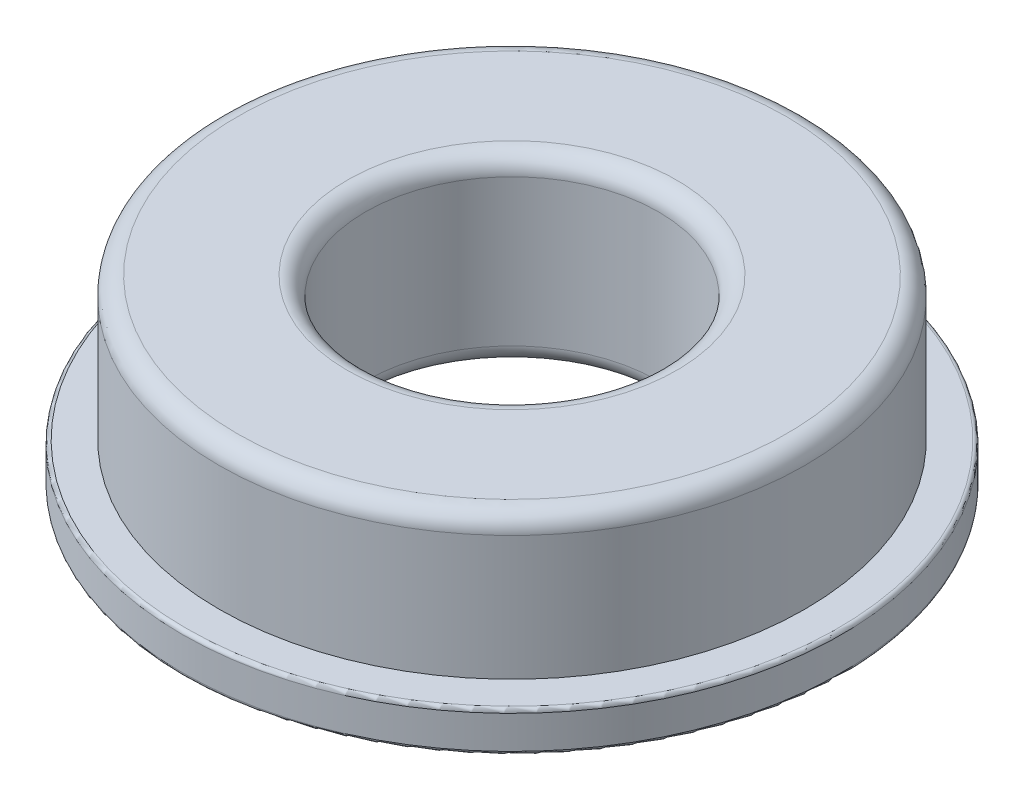
ISO-10303-21;
HEADER;
FILE_DESCRIPTION(('STEP AP214'),'2;1');
FILE_NAME('part.step','',(''),(''),'','','');
FILE_SCHEMA(('AUTOMOTIVE_DESIGN { 1 0 10303 214 1 1 1 1 }'));
ENDSEC;
DATA;
#1=APPLICATION_CONTEXT('core data for automotive mechanical design processes');
#2=APPLICATION_PROTOCOL_DEFINITION('international standard','automotive_design',2000,#1);
#3=PRODUCT_CONTEXT('',#1,'mechanical');
#4=PRODUCT('Part','Part','',(#3));
#5=PRODUCT_RELATED_PRODUCT_CATEGORY('part','',(#4));
#6=PRODUCT_DEFINITION_FORMATION('','',#4);
#7=PRODUCT_DEFINITION_CONTEXT('part definition',#1,'design');
#8=PRODUCT_DEFINITION('design','',#6,#7);
#9=PRODUCT_DEFINITION_SHAPE('','',#8);
#10=(LENGTH_UNIT() NAMED_UNIT(*) SI_UNIT(.MILLI.,.METRE.));
#11=(NAMED_UNIT(*) PLANE_ANGLE_UNIT() SI_UNIT($,.RADIAN.));
#12=(NAMED_UNIT(*) SI_UNIT($,.STERADIAN.) SOLID_ANGLE_UNIT());
#13=UNCERTAINTY_MEASURE_WITH_UNIT(LENGTH_MEASURE(1.E-05),#10,'distance_accuracy_value','');
#14=(GEOMETRIC_REPRESENTATION_CONTEXT(3) GLOBAL_UNCERTAINTY_ASSIGNED_CONTEXT((#13)) GLOBAL_UNIT_ASSIGNED_CONTEXT((#10,
#11,#12)) REPRESENTATION_CONTEXT('',''));
#15=CARTESIAN_POINT('',(0.,0.,0.));
#16=DIRECTION('',(0.,0.,1.));
#17=DIRECTION('',(1.,0.,0.));
#18=AXIS2_PLACEMENT_3D('',#15,#16,#17);
#19=CARTESIAN_POINT('',(0.,5.,0.));
#20=DIRECTION('',(0.,-1.,0.));
#21=DIRECTION('',(0.,0.,-1.));
#22=AXIS2_PLACEMENT_3D('',#19,#20,#21);
#23=CYLINDRICAL_SURFACE('',#22,9.);
#24=CARTESIAN_POINT('',(0.,0.1,0.));
#25=DIRECTION('',(0.,1.,0.));
#26=DIRECTION('',(0.,0.,1.));
#27=AXIS2_PLACEMENT_3D('',#24,#25,#26);
#28=CIRCLE('',#27,9.);
#29=CARTESIAN_POINT('',(0.,0.1,9.));
#30=VERTEX_POINT('',#29);
#31=EDGE_CURVE('E37',#30,#30,#28,.T.);
#32=ORIENTED_EDGE('',*,*,#31,.T.);
#33=EDGE_LOOP('',(#32));
#34=FACE_BOUND('',#33,.T.);
#35=CARTESIAN_POINT('',(0.,1.,0.));
#36=DIRECTION('',(0.,1.,0.));
#37=DIRECTION('',(0.,0.,1.));
#38=AXIS2_PLACEMENT_3D('',#35,#36,#37);
#39=CIRCLE('',#38,9.);
#40=CARTESIAN_POINT('',(0.,1.,9.));
#41=VERTEX_POINT('',#40);
#42=EDGE_CURVE('E41',#41,#41,#39,.F.);
#43=ORIENTED_EDGE('',*,*,#42,.T.);
#44=EDGE_LOOP('',(#43));
#45=FACE_BOUND('',#44,.T.);
#46=ADVANCED_FACE('F30',(#34,#45),#23,.T.);
#47=CARTESIAN_POINT('',(0.,0.,0.));
#48=DIRECTION('',(0.,1.,0.));
#49=DIRECTION('',(0.,0.,1.));
#50=AXIS2_PLACEMENT_3D('',#47,#48,#49);
#51=PLANE('',#50);
#52=CARTESIAN_POINT('',(0.,0.,0.));
#53=DIRECTION('',(0.,1.,0.));
#54=DIRECTION('',(0.,0.,1.));
#55=AXIS2_PLACEMENT_3D('',#52,#53,#54);
#56=CIRCLE('',#55,8.9);
#57=CARTESIAN_POINT('',(0.,0.,8.9));
#58=VERTEX_POINT('',#57);
#59=EDGE_CURVE('E10',#58,#58,#56,.F.);
#60=ORIENTED_EDGE('',*,*,#59,.T.);
#61=EDGE_LOOP('',(#60));
#62=FACE_BOUND('',#61,.T.);
#63=CARTESIAN_POINT('',(0.,0.,0.));
#64=DIRECTION('',(0.,1.,0.));
#65=DIRECTION('',(0.,0.,1.));
#66=AXIS2_PLACEMENT_3D('',#63,#64,#65);
#67=CIRCLE('',#66,4.5);
#68=CARTESIAN_POINT('',(0.,0.,4.5));
#69=VERTEX_POINT('',#68);
#70=EDGE_CURVE('E65',#69,#69,#67,.T.);
#71=ORIENTED_EDGE('',*,*,#70,.T.);
#72=EDGE_LOOP('',(#71));
#73=FACE_BOUND('',#72,.T.);
#74=ADVANCED_FACE('F76',(#62,#73),#51,.F.);
#75=CARTESIAN_POINT('',(0.,1.1,0.));
#76=DIRECTION('',(0.,1.,0.));
#77=DIRECTION('',(0.,0.,1.));
#78=AXIS2_PLACEMENT_3D('',#75,#76,#77);
#79=PLANE('',#78);
#80=CARTESIAN_POINT('',(0.,1.1,0.));
#81=DIRECTION('',(0.,1.,0.));
#82=DIRECTION('',(0.,0.,1.));
#83=AXIS2_PLACEMENT_3D('',#80,#81,#82);
#84=CIRCLE('',#83,8.9);
#85=CARTESIAN_POINT('',(0.,1.1,8.9));
#86=VERTEX_POINT('',#85);
#87=EDGE_CURVE('E45',#86,#86,#84,.T.);
#88=ORIENTED_EDGE('',*,*,#87,.T.);
#89=EDGE_LOOP('',(#88));
#90=FACE_BOUND('',#89,.T.);
#91=CARTESIAN_POINT('',(0.,1.1,0.));
#92=DIRECTION('',(0.,1.,0.));
#93=DIRECTION('',(0.,0.,1.));
#94=AXIS2_PLACEMENT_3D('',#91,#92,#93);
#95=CIRCLE('',#94,8.);
#96=CARTESIAN_POINT('',(0.,1.1,8.));
#97=VERTEX_POINT('',#96);
#98=EDGE_CURVE('E68',#97,#97,#95,.T.);
#99=ORIENTED_EDGE('',*,*,#98,.F.);
#100=EDGE_LOOP('',(#99));
#101=FACE_BOUND('',#100,.T.);
#102=ADVANCED_FACE('F74',(#90,#101),#79,.T.);
#103=CARTESIAN_POINT('',(0.,1.1,0.));
#104=DIRECTION('',(0.,1.,0.));
#105=DIRECTION('',(0.,0.,1.));
#106=AXIS2_PLACEMENT_3D('',#103,#104,#105);
#107=CYLINDRICAL_SURFACE('',#106,8.);
#108=CARTESIAN_POINT('',(0.,4.5,0.));
#109=DIRECTION('',(0.,1.,0.));
#110=DIRECTION('',(0.,0.,1.));
#111=AXIS2_PLACEMENT_3D('',#108,#109,#110);
#112=CIRCLE('',#111,8.);
#113=CARTESIAN_POINT('',(0.,4.5,8.));
#114=VERTEX_POINT('',#113);
#115=EDGE_CURVE('E50',#114,#114,#112,.F.);
#116=ORIENTED_EDGE('',*,*,#115,.T.);
#117=EDGE_LOOP('',(#116));
#118=FACE_BOUND('',#117,.T.);
#119=ORIENTED_EDGE('',*,*,#98,.T.);
#120=EDGE_LOOP('',(#119));
#121=FACE_BOUND('',#120,.T.);
#122=ADVANCED_FACE('F72',(#118,#121),#107,.T.);
#123=CARTESIAN_POINT('',(0.,5.,0.));
#124=DIRECTION('',(0.,1.,0.));
#125=DIRECTION('',(0.,0.,1.));
#126=AXIS2_PLACEMENT_3D('',#123,#124,#125);
#127=PLANE('',#126);
#128=CARTESIAN_POINT('',(0.,5.,0.));
#129=DIRECTION('',(0.,1.,0.));
#130=DIRECTION('',(0.,0.,1.));
#131=AXIS2_PLACEMENT_3D('',#128,#129,#130);
#132=CIRCLE('',#131,4.5);
#133=CARTESIAN_POINT('',(0.,5.,4.5));
#134=VERTEX_POINT('',#133);
#135=EDGE_CURVE('E53',#134,#134,#132,.F.);
#136=ORIENTED_EDGE('',*,*,#135,.T.);
#137=EDGE_LOOP('',(#136));
#138=FACE_BOUND('',#137,.T.);
#139=CARTESIAN_POINT('',(0.,5.,0.));
#140=DIRECTION('',(0.,1.,0.));
#141=DIRECTION('',(0.,0.,1.));
#142=AXIS2_PLACEMENT_3D('',#139,#140,#141);
#143=CIRCLE('',#142,7.5);
#144=CARTESIAN_POINT('',(0.,5.,7.5));
#145=VERTEX_POINT('',#144);
#146=EDGE_CURVE('E56',#145,#145,#143,.T.);
#147=ORIENTED_EDGE('',*,*,#146,.T.);
#148=EDGE_LOOP('',(#147));
#149=FACE_BOUND('',#148,.T.);
#150=ADVANCED_FACE('F83',(#138,#149),#127,.T.);
#151=CARTESIAN_POINT('',(0.,0.,0.));
#152=DIRECTION('',(0.,1.,0.));
#153=DIRECTION('',(0.,0.,1.));
#154=AXIS2_PLACEMENT_3D('',#151,#152,#153);
#155=CYLINDRICAL_SURFACE('',#154,4.);
#156=CARTESIAN_POINT('',(0.,0.5,0.));
#157=DIRECTION('',(0.,1.,0.));
#158=DIRECTION('',(0.,0.,1.));
#159=AXIS2_PLACEMENT_3D('',#156,#157,#158);
#160=CIRCLE('',#159,4.);
#161=CARTESIAN_POINT('',(0.,0.5,4.));
#162=VERTEX_POINT('',#161);
#163=EDGE_CURVE('E59',#162,#162,#160,.F.);
#164=ORIENTED_EDGE('',*,*,#163,.T.);
#165=EDGE_LOOP('',(#164));
#166=FACE_BOUND('',#165,.T.);
#167=CARTESIAN_POINT('',(0.,4.5,0.));
#168=DIRECTION('',(0.,1.,0.));
#169=DIRECTION('',(0.,0.,1.));
#170=AXIS2_PLACEMENT_3D('',#167,#168,#169);
#171=CIRCLE('',#170,4.);
#172=CARTESIAN_POINT('',(0.,4.5,4.));
#173=VERTEX_POINT('',#172);
#174=EDGE_CURVE('E62',#173,#173,#171,.T.);
#175=ORIENTED_EDGE('',*,*,#174,.T.);
#176=EDGE_LOOP('',(#175));
#177=FACE_BOUND('',#176,.T.);
#178=ADVANCED_FACE('F98',(#166,#177),#155,.F.);
#179=CARTESIAN_POINT('',(0.,0.5,0.));
#180=DIRECTION('',(0.,1.,0.));
#181=DIRECTION('',(0.,0.,1.));
#182=AXIS2_PLACEMENT_3D('',#179,#180,#181);
#183=TOROIDAL_SURFACE('',#182,4.5,0.5);
#184=ORIENTED_EDGE('',*,*,#163,.F.);
#185=EDGE_LOOP('',(#184));
#186=FACE_BOUND('',#185,.T.);
#187=ORIENTED_EDGE('',*,*,#70,.F.);
#188=EDGE_LOOP('',(#187));
#189=FACE_BOUND('',#188,.T.);
#190=ADVANCED_FACE('F94',(#186,#189),#183,.T.);
#191=CARTESIAN_POINT('',(0.,4.5,0.));
#192=DIRECTION('',(0.,1.,0.));
#193=DIRECTION('',(0.,0.,1.));
#194=AXIS2_PLACEMENT_3D('',#191,#192,#193);
#195=TOROIDAL_SURFACE('',#194,4.5,0.5);
#196=ORIENTED_EDGE('',*,*,#135,.F.);
#197=EDGE_LOOP('',(#196));
#198=FACE_BOUND('',#197,.T.);
#199=ORIENTED_EDGE('',*,*,#174,.F.);
#200=EDGE_LOOP('',(#199));
#201=FACE_BOUND('',#200,.T.);
#202=ADVANCED_FACE('F97',(#198,#201),#195,.T.);
#203=CARTESIAN_POINT('',(0.,4.5,0.));
#204=DIRECTION('',(0.,1.,0.));
#205=DIRECTION('',(0.,0.,1.));
#206=AXIS2_PLACEMENT_3D('',#203,#204,#205);
#207=TOROIDAL_SURFACE('',#206,7.5,0.5);
#208=ORIENTED_EDGE('',*,*,#115,.F.);
#209=EDGE_LOOP('',(#208));
#210=FACE_BOUND('',#209,.T.);
#211=ORIENTED_EDGE('',*,*,#146,.F.);
#212=EDGE_LOOP('',(#211));
#213=FACE_BOUND('',#212,.T.);
#214=ADVANCED_FACE('F102',(#210,#213),#207,.T.);
#215=CARTESIAN_POINT('',(0.,1.,0.));
#216=DIRECTION('',(0.,1.,0.));
#217=DIRECTION('',(0.,0.,1.));
#218=AXIS2_PLACEMENT_3D('',#215,#216,#217);
#219=TOROIDAL_SURFACE('',#218,8.9,0.1);
#220=ORIENTED_EDGE('',*,*,#42,.F.);
#221=EDGE_LOOP('',(#220));
#222=FACE_BOUND('',#221,.T.);
#223=ORIENTED_EDGE('',*,*,#87,.F.);
#224=EDGE_LOOP('',(#223));
#225=FACE_BOUND('',#224,.T.);
#226=ADVANCED_FACE('F105',(#222,#225),#219,.T.);
#227=CARTESIAN_POINT('',(0.,0.1,0.));
#228=DIRECTION('',(0.,1.,0.));
#229=DIRECTION('',(0.,0.,1.));
#230=AXIS2_PLACEMENT_3D('',#227,#228,#229);
#231=TOROIDAL_SURFACE('',#230,8.9,0.1);
#232=ORIENTED_EDGE('',*,*,#59,.F.);
#233=EDGE_LOOP('',(#232));
#234=FACE_BOUND('',#233,.T.);
#235=ORIENTED_EDGE('',*,*,#31,.F.);
#236=EDGE_LOOP('',(#235));
#237=FACE_BOUND('',#236,.T.);
#238=ADVANCED_FACE('F32',(#234,#237),#231,.T.);
#239=CLOSED_SHELL('',(#46,#74,#102,#122,#150,#178,#190,#202,#214,#226,#238));
#240=MANIFOLD_SOLID_BREP('B2',#239);
#241=ADVANCED_BREP_SHAPE_REPRESENTATION('',(#18,#240),#14);
#242=SHAPE_DEFINITION_REPRESENTATION(#9,#241);
ENDSEC;
END-ISO-10303-21;
